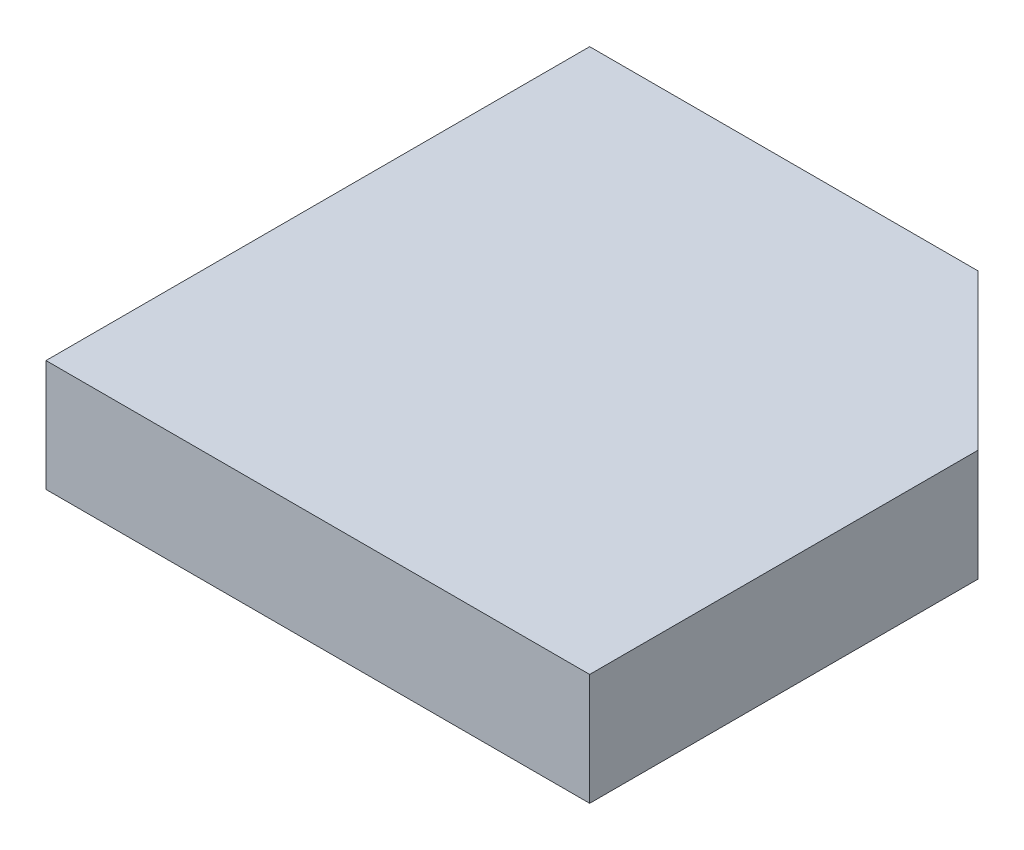
ISO-10303-21;
HEADER;
FILE_DESCRIPTION(('STEP AP214'),'2;1');
FILE_NAME('part.step','',(''),(''),'','','');
FILE_SCHEMA(('AUTOMOTIVE_DESIGN { 1 0 10303 214 1 1 1 1 }'));
ENDSEC;
DATA;
#1=APPLICATION_CONTEXT('core data for automotive mechanical design processes');
#2=APPLICATION_PROTOCOL_DEFINITION('international standard','automotive_design',2000,#1);
#3=PRODUCT_CONTEXT('',#1,'mechanical');
#4=PRODUCT('Part','Part','',(#3));
#5=PRODUCT_RELATED_PRODUCT_CATEGORY('part','',(#4));
#6=PRODUCT_DEFINITION_FORMATION('','',#4);
#7=PRODUCT_DEFINITION_CONTEXT('part definition',#1,'design');
#8=PRODUCT_DEFINITION('design','',#6,#7);
#9=PRODUCT_DEFINITION_SHAPE('','',#8);
#10=(LENGTH_UNIT() NAMED_UNIT(*) SI_UNIT(.MILLI.,.METRE.));
#11=(NAMED_UNIT(*) PLANE_ANGLE_UNIT() SI_UNIT($,.RADIAN.));
#12=(NAMED_UNIT(*) SI_UNIT($,.STERADIAN.) SOLID_ANGLE_UNIT());
#13=UNCERTAINTY_MEASURE_WITH_UNIT(LENGTH_MEASURE(1.E-05),#10,'distance_accuracy_value','');
#14=(GEOMETRIC_REPRESENTATION_CONTEXT(3) GLOBAL_UNCERTAINTY_ASSIGNED_CONTEXT((#13)) GLOBAL_UNIT_ASSIGNED_CONTEXT((#10,
#11,#12)) REPRESENTATION_CONTEXT('',''));
#15=CARTESIAN_POINT('',(0.,0.,0.));
#16=DIRECTION('',(0.,0.,1.));
#17=DIRECTION('',(1.,0.,0.));
#18=AXIS2_PLACEMENT_3D('',#15,#16,#17);
#19=CARTESIAN_POINT('',(44.45,18.25625,-44.45));
#20=DIRECTION('',(-1.,0.,0.));
#21=DIRECTION('',(0.,0.,1.));
#22=AXIS2_PLACEMENT_3D('',#19,#20,#21);
#23=PLANE('',#22);
#24=DIRECTION('',(0.,0.,-1.));
#25=VECTOR('',#24,1.);
#26=CARTESIAN_POINT('',(44.45,0.,-44.45));
#27=LINE('',#26,#25);
#28=CARTESIAN_POINT('',(44.45,0.,44.45));
#29=VERTEX_POINT('',#28);
#30=CARTESIAN_POINT('',(44.45,0.,-19.05));
#31=VERTEX_POINT('',#30);
#32=EDGE_CURVE('E102',#29,#31,#27,.T.);
#33=ORIENTED_EDGE('',*,*,#32,.T.);
#34=DIRECTION('',(0.,1.,0.));
#35=VECTOR('',#34,1.);
#36=CARTESIAN_POINT('',(44.45,0.,-19.05));
#37=LINE('',#36,#35);
#38=CARTESIAN_POINT('',(44.45,18.25625,-19.05));
#39=VERTEX_POINT('',#38);
#40=EDGE_CURVE('E46',#31,#39,#37,.T.);
#41=ORIENTED_EDGE('',*,*,#40,.T.);
#42=DIRECTION('',(0.,0.,-1.));
#43=VECTOR('',#42,1.);
#44=CARTESIAN_POINT('',(44.45,18.25625,-44.45));
#45=LINE('',#44,#43);
#46=CARTESIAN_POINT('',(44.45,18.25625,44.45));
#47=VERTEX_POINT('',#46);
#48=EDGE_CURVE('E109',#47,#39,#45,.T.);
#49=ORIENTED_EDGE('',*,*,#48,.F.);
#50=DIRECTION('',(0.,-1.,0.));
#51=VECTOR('',#50,1.);
#52=CARTESIAN_POINT('',(44.45,18.25625,44.45));
#53=LINE('',#52,#51);
#54=EDGE_CURVE('E110',#47,#29,#53,.T.);
#55=ORIENTED_EDGE('',*,*,#54,.T.);
#56=EDGE_LOOP('',(#33,#41,#49,#55));
#57=FACE_BOUND('',#56,.T.);
#58=ADVANCED_FACE('F32',(#57),#23,.F.);
#59=CARTESIAN_POINT('',(-44.45,18.25625,-44.45));
#60=DIRECTION('',(0.,0.,1.));
#61=DIRECTION('',(1.,0.,0.));
#62=AXIS2_PLACEMENT_3D('',#59,#60,#61);
#63=PLANE('',#62);
#64=DIRECTION('',(-1.,0.,0.));
#65=VECTOR('',#64,1.);
#66=CARTESIAN_POINT('',(-44.45,18.25625,-44.45));
#67=LINE('',#66,#65);
#68=CARTESIAN_POINT('',(19.05,18.25625,-44.45));
#69=VERTEX_POINT('',#68);
#70=CARTESIAN_POINT('',(-44.45,18.25625,-44.45));
#71=VERTEX_POINT('',#70);
#72=EDGE_CURVE('E77',#69,#71,#67,.T.);
#73=ORIENTED_EDGE('',*,*,#72,.F.);
#74=DIRECTION('',(0.,1.,0.));
#75=VECTOR('',#74,1.);
#76=CARTESIAN_POINT('',(19.05,0.,-44.45));
#77=LINE('',#76,#75);
#78=CARTESIAN_POINT('',(19.05,0.,-44.45));
#79=VERTEX_POINT('',#78);
#80=EDGE_CURVE('E88',#79,#69,#77,.T.);
#81=ORIENTED_EDGE('',*,*,#80,.F.);
#82=DIRECTION('',(-1.,0.,0.));
#83=VECTOR('',#82,1.);
#84=CARTESIAN_POINT('',(-44.45,0.,-44.45));
#85=LINE('',#84,#83);
#86=CARTESIAN_POINT('',(-44.45,0.,-44.45));
#87=VERTEX_POINT('',#86);
#88=EDGE_CURVE('E97',#79,#87,#85,.T.);
#89=ORIENTED_EDGE('',*,*,#88,.T.);
#90=DIRECTION('',(0.,-1.,0.));
#91=VECTOR('',#90,1.);
#92=CARTESIAN_POINT('',(-44.45,18.25625,-44.45));
#93=LINE('',#92,#91);
#94=EDGE_CURVE('E11',#71,#87,#93,.T.);
#95=ORIENTED_EDGE('',*,*,#94,.F.);
#96=EDGE_LOOP('',(#73,#81,#89,#95));
#97=FACE_BOUND('',#96,.T.);
#98=ADVANCED_FACE('F96',(#97),#63,.F.);
#99=CARTESIAN_POINT('',(-44.45,18.25625,-44.45));
#100=DIRECTION('',(1.,0.,0.));
#101=DIRECTION('',(0.,0.,-1.));
#102=AXIS2_PLACEMENT_3D('',#99,#100,#101);
#103=PLANE('',#102);
#104=DIRECTION('',(0.,0.,1.));
#105=VECTOR('',#104,1.);
#106=CARTESIAN_POINT('',(-44.45,0.,-44.45));
#107=LINE('',#106,#105);
#108=CARTESIAN_POINT('',(-44.45,0.,44.45));
#109=VERTEX_POINT('',#108);
#110=EDGE_CURVE('E101',#87,#109,#107,.T.);
#111=ORIENTED_EDGE('',*,*,#110,.T.);
#112=DIRECTION('',(0.,-1.,0.));
#113=VECTOR('',#112,1.);
#114=CARTESIAN_POINT('',(-44.45,18.25625,44.45));
#115=LINE('',#114,#113);
#116=CARTESIAN_POINT('',(-44.45,18.25625,44.45));
#117=VERTEX_POINT('',#116);
#118=EDGE_CURVE('E39',#117,#109,#115,.T.);
#119=ORIENTED_EDGE('',*,*,#118,.F.);
#120=DIRECTION('',(0.,0.,1.));
#121=VECTOR('',#120,1.);
#122=CARTESIAN_POINT('',(-44.45,18.25625,-44.45));
#123=LINE('',#122,#121);
#124=EDGE_CURVE('E118',#71,#117,#123,.T.);
#125=ORIENTED_EDGE('',*,*,#124,.F.);
#126=ORIENTED_EDGE('',*,*,#94,.T.);
#127=EDGE_LOOP('',(#111,#119,#125,#126));
#128=FACE_BOUND('',#127,.T.);
#129=ADVANCED_FACE('F123',(#128),#103,.F.);
#130=CARTESIAN_POINT('',(-44.45,18.25625,44.45));
#131=DIRECTION('',(0.,0.,-1.));
#132=DIRECTION('',(-1.,0.,0.));
#133=AXIS2_PLACEMENT_3D('',#130,#131,#132);
#134=PLANE('',#133);
#135=DIRECTION('',(1.,0.,0.));
#136=VECTOR('',#135,1.);
#137=CARTESIAN_POINT('',(-44.45,0.,44.45));
#138=LINE('',#137,#136);
#139=EDGE_CURVE('E72',#109,#29,#138,.T.);
#140=ORIENTED_EDGE('',*,*,#139,.T.);
#141=ORIENTED_EDGE('',*,*,#54,.F.);
#142=DIRECTION('',(1.,0.,0.));
#143=VECTOR('',#142,1.);
#144=CARTESIAN_POINT('',(-44.45,18.25625,44.45));
#145=LINE('',#144,#143);
#146=EDGE_CURVE('E55',#117,#47,#145,.T.);
#147=ORIENTED_EDGE('',*,*,#146,.F.);
#148=ORIENTED_EDGE('',*,*,#118,.T.);
#149=EDGE_LOOP('',(#140,#141,#147,#148));
#150=FACE_BOUND('',#149,.T.);
#151=ADVANCED_FACE('F112',(#150),#134,.F.);
#152=CARTESIAN_POINT('',(0.,18.25625,0.));
#153=DIRECTION('',(0.,1.,0.));
#154=DIRECTION('',(0.,0.,1.));
#155=AXIS2_PLACEMENT_3D('',#152,#153,#154);
#156=PLANE('',#155);
#157=DIRECTION('',(0.707106781186548,0.,0.707106781186548));
#158=VECTOR('',#157,1.);
#159=CARTESIAN_POINT('',(44.45,18.25625,-19.05));
#160=LINE('',#159,#158);
#161=EDGE_CURVE('E93',#69,#39,#160,.T.);
#162=ORIENTED_EDGE('',*,*,#161,.F.);
#163=ORIENTED_EDGE('',*,*,#72,.T.);
#164=ORIENTED_EDGE('',*,*,#124,.T.);
#165=ORIENTED_EDGE('',*,*,#146,.T.);
#166=ORIENTED_EDGE('',*,*,#48,.T.);
#167=EDGE_LOOP('',(#162,#163,#164,#165,#166));
#168=FACE_BOUND('',#167,.T.);
#169=ADVANCED_FACE('F122',(#168),#156,.T.);
#170=CARTESIAN_POINT('',(0.,0.,0.));
#171=DIRECTION('',(0.,1.,0.));
#172=DIRECTION('',(0.,0.,1.));
#173=AXIS2_PLACEMENT_3D('',#170,#171,#172);
#174=PLANE('',#173);
#175=ORIENTED_EDGE('',*,*,#88,.F.);
#176=DIRECTION('',(0.707106781186548,0.,0.707106781186548));
#177=VECTOR('',#176,1.);
#178=CARTESIAN_POINT('',(44.45,0.,-19.05));
#179=LINE('',#178,#177);
#180=EDGE_CURVE('E85',#79,#31,#179,.T.);
#181=ORIENTED_EDGE('',*,*,#180,.T.);
#182=ORIENTED_EDGE('',*,*,#32,.F.);
#183=ORIENTED_EDGE('',*,*,#139,.F.);
#184=ORIENTED_EDGE('',*,*,#110,.F.);
#185=EDGE_LOOP('',(#175,#181,#182,#183,#184));
#186=FACE_BOUND('',#185,.T.);
#187=ADVANCED_FACE('F100',(#186),#174,.F.);
#188=CARTESIAN_POINT('',(44.45,0.,-19.05));
#189=DIRECTION('',(-0.707106781186548,0.,0.707106781186548));
#190=DIRECTION('',(0.707106781186548,0.,0.707106781186548));
#191=AXIS2_PLACEMENT_3D('',#188,#189,#190);
#192=PLANE('',#191);
#193=ORIENTED_EDGE('',*,*,#161,.T.);
#194=ORIENTED_EDGE('',*,*,#40,.F.);
#195=ORIENTED_EDGE('',*,*,#180,.F.);
#196=ORIENTED_EDGE('',*,*,#80,.T.);
#197=EDGE_LOOP('',(#193,#194,#195,#196));
#198=FACE_BOUND('',#197,.T.);
#199=ADVANCED_FACE('F87',(#198),#192,.F.);
#200=CLOSED_SHELL('',(#58,#98,#129,#151,#169,#187,#199));
#201=MANIFOLD_SOLID_BREP('B2',#200);
#202=ADVANCED_BREP_SHAPE_REPRESENTATION('',(#18,#201),#14);
#203=SHAPE_DEFINITION_REPRESENTATION(#9,#202);
ENDSEC;
END-ISO-10303-21;
